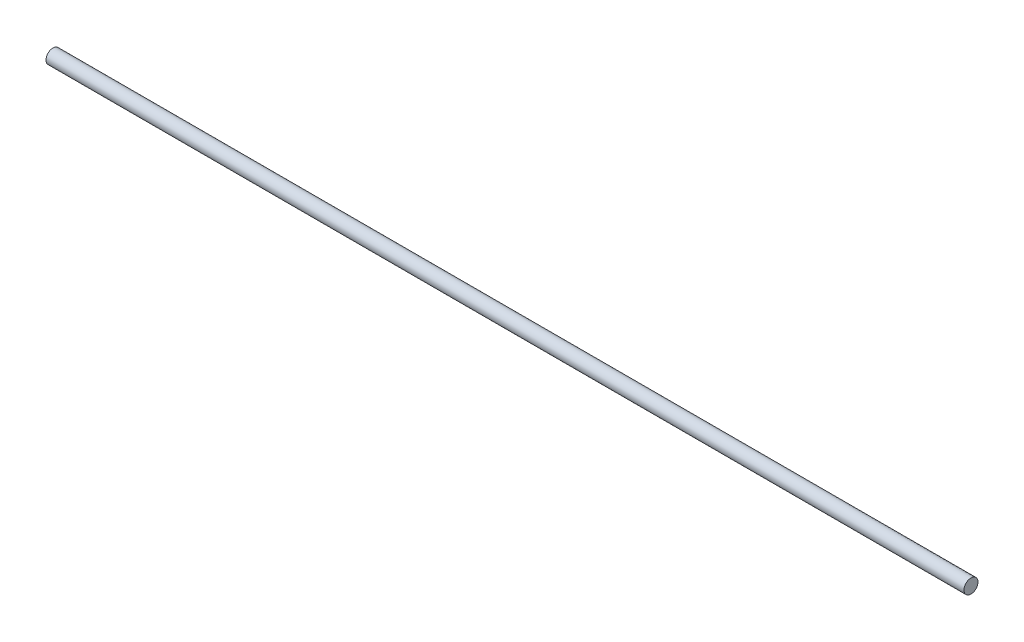
ISO-10303-21;
HEADER;
FILE_DESCRIPTION(('STEP AP214'),'2;1');
FILE_NAME('part.step','',(''),(''),'','','');
FILE_SCHEMA(('AUTOMOTIVE_DESIGN { 1 0 10303 214 1 1 1 1 }'));
ENDSEC;
DATA;
#1=APPLICATION_CONTEXT('core data for automotive mechanical design processes');
#2=APPLICATION_PROTOCOL_DEFINITION('international standard','automotive_design',2000,#1);
#3=PRODUCT_CONTEXT('',#1,'mechanical');
#4=PRODUCT('Part','Part','',(#3));
#5=PRODUCT_RELATED_PRODUCT_CATEGORY('part','',(#4));
#6=PRODUCT_DEFINITION_FORMATION('','',#4);
#7=PRODUCT_DEFINITION_CONTEXT('part definition',#1,'design');
#8=PRODUCT_DEFINITION('design','',#6,#7);
#9=PRODUCT_DEFINITION_SHAPE('','',#8);
#10=(LENGTH_UNIT() NAMED_UNIT(*) SI_UNIT(.MILLI.,.METRE.));
#11=(NAMED_UNIT(*) PLANE_ANGLE_UNIT() SI_UNIT($,.RADIAN.));
#12=(NAMED_UNIT(*) SI_UNIT($,.STERADIAN.) SOLID_ANGLE_UNIT());
#13=UNCERTAINTY_MEASURE_WITH_UNIT(LENGTH_MEASURE(1.E-05),#10,'distance_accuracy_value','');
#14=(GEOMETRIC_REPRESENTATION_CONTEXT(3) GLOBAL_UNCERTAINTY_ASSIGNED_CONTEXT((#13)) GLOBAL_UNIT_ASSIGNED_CONTEXT((#10,
#11,#12)) REPRESENTATION_CONTEXT('',''));
#15=CARTESIAN_POINT('',(0.,0.,0.));
#16=DIRECTION('',(0.,0.,1.));
#17=DIRECTION('',(1.,0.,0.));
#18=AXIS2_PLACEMENT_3D('',#15,#16,#17);
#19=CARTESIAN_POINT('',(261.9,0.,0.));
#20=DIRECTION('',(-1.,0.,0.));
#21=DIRECTION('',(0.,0.,1.));
#22=AXIS2_PLACEMENT_3D('',#19,#20,#21);
#23=CYLINDRICAL_SURFACE('',#22,4.);
#24=CARTESIAN_POINT('',(261.9,0.,0.));
#25=DIRECTION('',(1.,0.,0.));
#26=DIRECTION('',(0.,0.,-1.));
#27=AXIS2_PLACEMENT_3D('',#24,#25,#26);
#28=CIRCLE('',#27,4.);
#29=CARTESIAN_POINT('',(261.9,0.,-4.));
#30=VERTEX_POINT('',#29);
#31=EDGE_CURVE('E10',#30,#30,#28,.T.);
#32=ORIENTED_EDGE('',*,*,#31,.F.);
#33=EDGE_LOOP('',(#32));
#34=FACE_BOUND('',#33,.T.);
#35=CARTESIAN_POINT('',(-261.9,0.,0.));
#36=DIRECTION('',(1.,0.,0.));
#37=DIRECTION('',(0.,0.,-1.));
#38=AXIS2_PLACEMENT_3D('',#35,#36,#37);
#39=CIRCLE('',#38,4.);
#40=CARTESIAN_POINT('',(-261.9,0.,-4.));
#41=VERTEX_POINT('',#40);
#42=EDGE_CURVE('E40',#41,#41,#39,.T.);
#43=ORIENTED_EDGE('',*,*,#42,.T.);
#44=EDGE_LOOP('',(#43));
#45=FACE_BOUND('',#44,.T.);
#46=ADVANCED_FACE('F37',(#34,#45),#23,.T.);
#47=CARTESIAN_POINT('',(261.9,0.,0.));
#48=DIRECTION('',(1.,0.,0.));
#49=DIRECTION('',(0.,0.,-1.));
#50=AXIS2_PLACEMENT_3D('',#47,#48,#49);
#51=PLANE('',#50);
#52=ORIENTED_EDGE('',*,*,#31,.T.);
#53=EDGE_LOOP('',(#52));
#54=FACE_BOUND('',#53,.T.);
#55=ADVANCED_FACE('F54',(#54),#51,.T.);
#56=CARTESIAN_POINT('',(-261.9,0.,0.));
#57=DIRECTION('',(1.,0.,0.));
#58=DIRECTION('',(0.,0.,-1.));
#59=AXIS2_PLACEMENT_3D('',#56,#57,#58);
#60=PLANE('',#59);
#61=ORIENTED_EDGE('',*,*,#42,.F.);
#62=EDGE_LOOP('',(#61));
#63=FACE_BOUND('',#62,.T.);
#64=ADVANCED_FACE('F52',(#63),#60,.F.);
#65=CLOSED_SHELL('',(#46,#55,#64));
#66=MANIFOLD_SOLID_BREP('B2',#65);
#67=ADVANCED_BREP_SHAPE_REPRESENTATION('',(#18,#66),#14);
#68=SHAPE_DEFINITION_REPRESENTATION(#9,#67);
ENDSEC;
END-ISO-10303-21;
